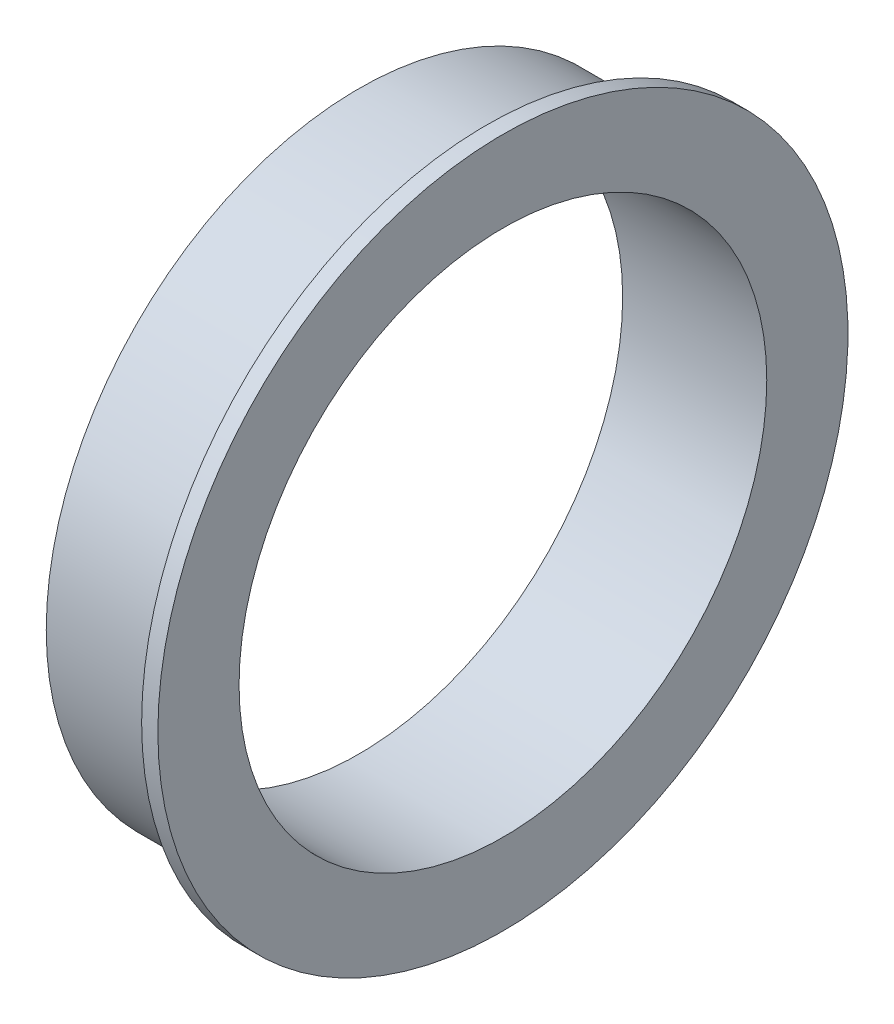
ISO-10303-21;
HEADER;
FILE_DESCRIPTION(('STEP AP214'),'2;1');
FILE_NAME('part.step','',(''),(''),'','','');
FILE_SCHEMA(('AUTOMOTIVE_DESIGN { 1 0 10303 214 1 1 1 1 }'));
ENDSEC;
DATA;
#1=APPLICATION_CONTEXT('core data for automotive mechanical design processes');
#2=APPLICATION_PROTOCOL_DEFINITION('international standard','automotive_design',2000,#1);
#3=PRODUCT_CONTEXT('',#1,'mechanical');
#4=PRODUCT('Part','Part','',(#3));
#5=PRODUCT_RELATED_PRODUCT_CATEGORY('part','',(#4));
#6=PRODUCT_DEFINITION_FORMATION('','',#4);
#7=PRODUCT_DEFINITION_CONTEXT('part definition',#1,'design');
#8=PRODUCT_DEFINITION('design','',#6,#7);
#9=PRODUCT_DEFINITION_SHAPE('','',#8);
#10=(LENGTH_UNIT() NAMED_UNIT(*) SI_UNIT(.MILLI.,.METRE.));
#11=(NAMED_UNIT(*) PLANE_ANGLE_UNIT() SI_UNIT($,.RADIAN.));
#12=(NAMED_UNIT(*) SI_UNIT($,.STERADIAN.) SOLID_ANGLE_UNIT());
#13=UNCERTAINTY_MEASURE_WITH_UNIT(LENGTH_MEASURE(1.E-05),#10,'distance_accuracy_value','');
#14=(GEOMETRIC_REPRESENTATION_CONTEXT(3) GLOBAL_UNCERTAINTY_ASSIGNED_CONTEXT((#13)) GLOBAL_UNIT_ASSIGNED_CONTEXT((#10,
#11,#12)) REPRESENTATION_CONTEXT('',''));
#15=CARTESIAN_POINT('',(0.,0.,0.));
#16=DIRECTION('',(0.,0.,1.));
#17=DIRECTION('',(1.,0.,0.));
#18=AXIS2_PLACEMENT_3D('',#15,#16,#17);
#19=CARTESIAN_POINT('',(14.9772333332692,65.,0.));
#20=DIRECTION('',(1.,0.,0.));
#21=DIRECTION('',(0.,0.,-1.));
#22=AXIS2_PLACEMENT_3D('',#19,#20,#21);
#23=PLANE('',#22);
#24=CARTESIAN_POINT('',(14.9772333332692,0.,0.));
#25=DIRECTION('',(-1.,0.,0.));
#26=DIRECTION('',(0.,0.,1.));
#27=AXIS2_PLACEMENT_3D('',#24,#25,#26);
#28=CIRCLE('',#27,65.);
#29=CARTESIAN_POINT('',(14.9772333332692,0.,65.));
#30=VERTEX_POINT('',#29);
#31=EDGE_CURVE('E56',#30,#30,#28,.T.);
#32=ORIENTED_EDGE('',*,*,#31,.F.);
#33=EDGE_LOOP('',(#32));
#34=FACE_BOUND('',#33,.T.);
#35=CARTESIAN_POINT('',(14.9772333332692,0.,0.));
#36=DIRECTION('',(-1.,0.,0.));
#37=DIRECTION('',(0.,0.,1.));
#38=AXIS2_PLACEMENT_3D('',#35,#36,#37);
#39=CIRCLE('',#38,77.);
#40=CARTESIAN_POINT('',(14.9772333332692,0.,77.));
#41=VERTEX_POINT('',#40);
#42=EDGE_CURVE('E10',#41,#41,#39,.T.);
#43=ORIENTED_EDGE('',*,*,#42,.T.);
#44=EDGE_LOOP('',(#43));
#45=FACE_BOUND('',#44,.T.);
#46=ADVANCED_FACE('F34',(#34,#45),#23,.F.);
#47=CARTESIAN_POINT('',(-46.2,0.,0.));
#48=DIRECTION('',(-1.,0.,0.));
#49=DIRECTION('',(0.,0.,1.));
#50=AXIS2_PLACEMENT_3D('',#47,#48,#49);
#51=CYLINDRICAL_SURFACE('',#50,77.);
#52=ORIENTED_EDGE('',*,*,#42,.F.);
#53=EDGE_LOOP('',(#52));
#54=FACE_BOUND('',#53,.T.);
#55=CARTESIAN_POINT('',(46.4772333332692,0.,0.));
#56=DIRECTION('',(-1.,0.,0.));
#57=DIRECTION('',(0.,0.,1.));
#58=AXIS2_PLACEMENT_3D('',#55,#56,#57);
#59=CIRCLE('',#58,77.);
#60=CARTESIAN_POINT('',(46.4772333332692,0.,77.));
#61=VERTEX_POINT('',#60);
#62=EDGE_CURVE('E40',#61,#61,#59,.T.);
#63=ORIENTED_EDGE('',*,*,#62,.T.);
#64=EDGE_LOOP('',(#63));
#65=FACE_BOUND('',#64,.T.);
#66=ADVANCED_FACE('F63',(#54,#65),#51,.T.);
#67=CARTESIAN_POINT('',(46.4772333332692,77.,0.));
#68=DIRECTION('',(1.,0.,0.));
#69=DIRECTION('',(0.,0.,-1.));
#70=AXIS2_PLACEMENT_3D('',#67,#68,#69);
#71=PLANE('',#70);
#72=ORIENTED_EDGE('',*,*,#62,.F.);
#73=EDGE_LOOP('',(#72));
#74=FACE_BOUND('',#73,.T.);
#75=CARTESIAN_POINT('',(46.4772333332692,0.,0.));
#76=DIRECTION('',(-1.,0.,0.));
#77=DIRECTION('',(0.,0.,1.));
#78=AXIS2_PLACEMENT_3D('',#75,#76,#77);
#79=CIRCLE('',#78,85.);
#80=CARTESIAN_POINT('',(46.4772333332692,0.,85.));
#81=VERTEX_POINT('',#80);
#82=EDGE_CURVE('E44',#81,#81,#79,.T.);
#83=ORIENTED_EDGE('',*,*,#82,.T.);
#84=EDGE_LOOP('',(#83));
#85=FACE_BOUND('',#84,.T.);
#86=ADVANCED_FACE('F67',(#74,#85),#71,.F.);
#87=CARTESIAN_POINT('',(-46.2,0.,0.));
#88=DIRECTION('',(-1.,0.,0.));
#89=DIRECTION('',(0.,0.,1.));
#90=AXIS2_PLACEMENT_3D('',#87,#88,#89);
#91=CYLINDRICAL_SURFACE('',#90,85.);
#92=ORIENTED_EDGE('',*,*,#82,.F.);
#93=EDGE_LOOP('',(#92));
#94=FACE_BOUND('',#93,.T.);
#95=CARTESIAN_POINT('',(50.4772333332692,0.,0.));
#96=DIRECTION('',(-1.,0.,0.));
#97=DIRECTION('',(0.,0.,1.));
#98=AXIS2_PLACEMENT_3D('',#95,#96,#97);
#99=CIRCLE('',#98,85.);
#100=CARTESIAN_POINT('',(50.4772333332692,0.,85.));
#101=VERTEX_POINT('',#100);
#102=EDGE_CURVE('E48',#101,#101,#99,.T.);
#103=ORIENTED_EDGE('',*,*,#102,.T.);
#104=EDGE_LOOP('',(#103));
#105=FACE_BOUND('',#104,.T.);
#106=ADVANCED_FACE('F72',(#94,#105),#91,.T.);
#107=CARTESIAN_POINT('',(50.4772333332692,85.,0.));
#108=DIRECTION('',(-1.,0.,0.));
#109=DIRECTION('',(0.,0.,1.));
#110=AXIS2_PLACEMENT_3D('',#107,#108,#109);
#111=PLANE('',#110);
#112=ORIENTED_EDGE('',*,*,#102,.F.);
#113=EDGE_LOOP('',(#112));
#114=FACE_BOUND('',#113,.T.);
#115=CARTESIAN_POINT('',(50.4772333332692,0.,0.));
#116=DIRECTION('',(-1.,0.,0.));
#117=DIRECTION('',(0.,0.,1.));
#118=AXIS2_PLACEMENT_3D('',#115,#116,#117);
#119=CIRCLE('',#118,65.);
#120=CARTESIAN_POINT('',(50.4772333332692,0.,65.));
#121=VERTEX_POINT('',#120);
#122=EDGE_CURVE('E53',#121,#121,#119,.T.);
#123=ORIENTED_EDGE('',*,*,#122,.T.);
#124=EDGE_LOOP('',(#123));
#125=FACE_BOUND('',#124,.T.);
#126=ADVANCED_FACE('F78',(#114,#125),#111,.F.);
#127=CARTESIAN_POINT('',(-46.2,0.,0.));
#128=DIRECTION('',(-1.,0.,0.));
#129=DIRECTION('',(0.,0.,1.));
#130=AXIS2_PLACEMENT_3D('',#127,#128,#129);
#131=CYLINDRICAL_SURFACE('',#130,65.);
#132=ORIENTED_EDGE('',*,*,#122,.F.);
#133=EDGE_LOOP('',(#132));
#134=FACE_BOUND('',#133,.T.);
#135=ORIENTED_EDGE('',*,*,#31,.T.);
#136=EDGE_LOOP('',(#135));
#137=FACE_BOUND('',#136,.T.);
#138=ADVANCED_FACE('F60',(#134,#137),#131,.F.);
#139=CLOSED_SHELL('',(#46,#66,#86,#106,#126,#138));
#140=MANIFOLD_SOLID_BREP('B2',#139);
#141=ADVANCED_BREP_SHAPE_REPRESENTATION('',(#18,#140),#14);
#142=SHAPE_DEFINITION_REPRESENTATION(#9,#141);
ENDSEC;
END-ISO-10303-21;
